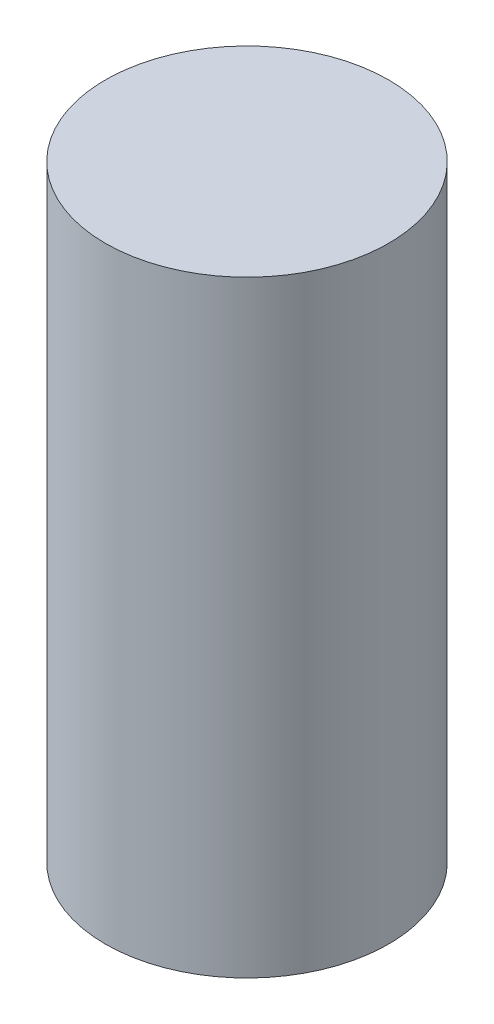
ISO-10303-21;
HEADER;
FILE_DESCRIPTION(('STEP AP214'),'2;1');
FILE_NAME('part.step','',(''),(''),'','','');
FILE_SCHEMA(('AUTOMOTIVE_DESIGN { 1 0 10303 214 1 1 1 1 }'));
ENDSEC;
DATA;
#1=APPLICATION_CONTEXT('core data for automotive mechanical design processes');
#2=APPLICATION_PROTOCOL_DEFINITION('international standard','automotive_design',2000,#1);
#3=PRODUCT_CONTEXT('',#1,'mechanical');
#4=PRODUCT('Part','Part','',(#3));
#5=PRODUCT_RELATED_PRODUCT_CATEGORY('part','',(#4));
#6=PRODUCT_DEFINITION_FORMATION('','',#4);
#7=PRODUCT_DEFINITION_CONTEXT('part definition',#1,'design');
#8=PRODUCT_DEFINITION('design','',#6,#7);
#9=PRODUCT_DEFINITION_SHAPE('','',#8);
#10=(LENGTH_UNIT() NAMED_UNIT(*) SI_UNIT(.MILLI.,.METRE.));
#11=(NAMED_UNIT(*) PLANE_ANGLE_UNIT() SI_UNIT($,.RADIAN.));
#12=(NAMED_UNIT(*) SI_UNIT($,.STERADIAN.) SOLID_ANGLE_UNIT());
#13=UNCERTAINTY_MEASURE_WITH_UNIT(LENGTH_MEASURE(1.E-05),#10,'distance_accuracy_value','');
#14=(GEOMETRIC_REPRESENTATION_CONTEXT(3) GLOBAL_UNCERTAINTY_ASSIGNED_CONTEXT((#13)) GLOBAL_UNIT_ASSIGNED_CONTEXT((#10,
#11,#12)) REPRESENTATION_CONTEXT('',''));
#15=CARTESIAN_POINT('',(0.,0.,0.));
#16=DIRECTION('',(0.,0.,1.));
#17=DIRECTION('',(1.,0.,0.));
#18=AXIS2_PLACEMENT_3D('',#15,#16,#17);
#19=CARTESIAN_POINT('',(350.,460.,-300.));
#20=DIRECTION('',(0.,-1.,0.));
#21=DIRECTION('',(0.,0.,-1.));
#22=AXIS2_PLACEMENT_3D('',#19,#20,#21);
#23=CYLINDRICAL_SURFACE('',#22,14.);
#24=CARTESIAN_POINT('',(350.,460.,-300.));
#25=DIRECTION('',(0.,1.,0.));
#26=DIRECTION('',(0.,0.,1.));
#27=AXIS2_PLACEMENT_3D('',#24,#25,#26);
#28=CIRCLE('',#27,14.);
#29=CARTESIAN_POINT('',(350.,460.,-286.));
#30=VERTEX_POINT('',#29);
#31=EDGE_CURVE('E10',#30,#30,#28,.T.);
#32=ORIENTED_EDGE('',*,*,#31,.F.);
#33=EDGE_LOOP('',(#32));
#34=FACE_BOUND('',#33,.T.);
#35=CARTESIAN_POINT('',(350.,400.,-300.));
#36=DIRECTION('',(0.,1.,0.));
#37=DIRECTION('',(0.,0.,1.));
#38=AXIS2_PLACEMENT_3D('',#35,#36,#37);
#39=CIRCLE('',#38,14.);
#40=CARTESIAN_POINT('',(350.,400.,-286.));
#41=VERTEX_POINT('',#40);
#42=EDGE_CURVE('E40',#41,#41,#39,.T.);
#43=ORIENTED_EDGE('',*,*,#42,.T.);
#44=EDGE_LOOP('',(#43));
#45=FACE_BOUND('',#44,.T.);
#46=ADVANCED_FACE('F37',(#34,#45),#23,.T.);
#47=CARTESIAN_POINT('',(350.,460.,-300.));
#48=DIRECTION('',(0.,1.,0.));
#49=DIRECTION('',(0.,0.,1.));
#50=AXIS2_PLACEMENT_3D('',#47,#48,#49);
#51=PLANE('',#50);
#52=ORIENTED_EDGE('',*,*,#31,.T.);
#53=EDGE_LOOP('',(#52));
#54=FACE_BOUND('',#53,.T.);
#55=ADVANCED_FACE('F52',(#54),#51,.T.);
#56=CARTESIAN_POINT('',(350.,400.,-300.));
#57=DIRECTION('',(0.,1.,0.));
#58=DIRECTION('',(0.,0.,1.));
#59=AXIS2_PLACEMENT_3D('',#56,#57,#58);
#60=PLANE('',#59);
#61=ORIENTED_EDGE('',*,*,#42,.F.);
#62=EDGE_LOOP('',(#61));
#63=FACE_BOUND('',#62,.T.);
#64=ADVANCED_FACE('F50',(#63),#60,.F.);
#65=CLOSED_SHELL('',(#46,#55,#64));
#66=MANIFOLD_SOLID_BREP('B2',#65);
#67=ADVANCED_BREP_SHAPE_REPRESENTATION('',(#18,#66),#14);
#68=SHAPE_DEFINITION_REPRESENTATION(#9,#67);
ENDSEC;
END-ISO-10303-21;
